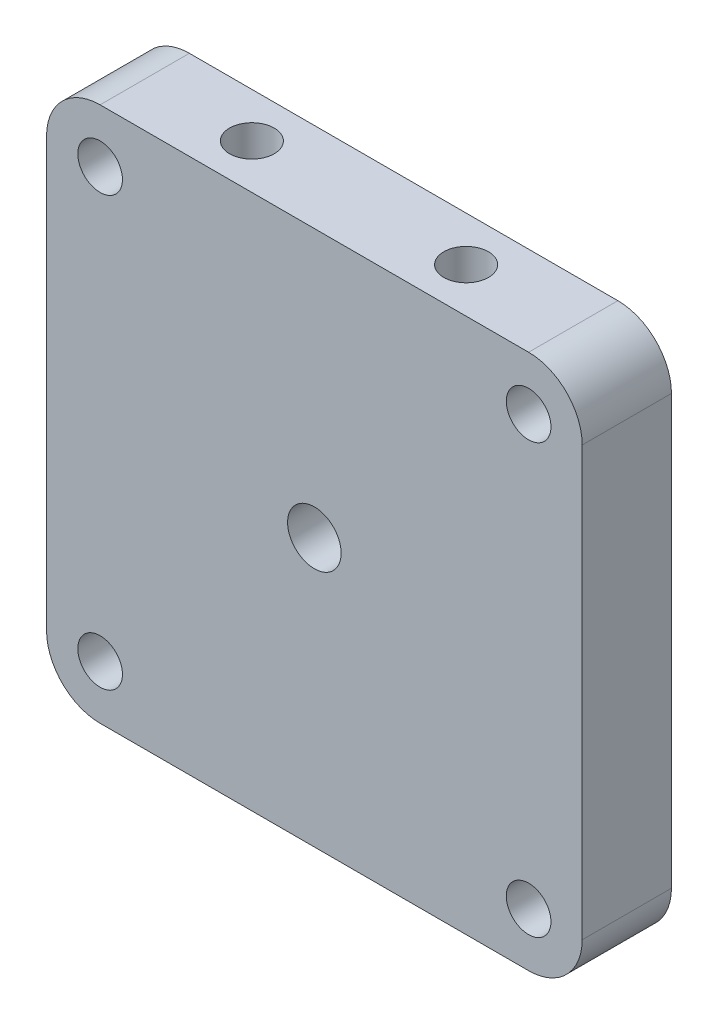
ISO-10303-21;
HEADER;
FILE_DESCRIPTION(('STEP AP214'),'2;1');
FILE_NAME('part.step','',(''),(''),'','','');
FILE_SCHEMA(('AUTOMOTIVE_DESIGN { 1 0 10303 214 1 1 1 1 }'));
ENDSEC;
DATA;
#1=APPLICATION_CONTEXT('core data for automotive mechanical design processes');
#2=APPLICATION_PROTOCOL_DEFINITION('international standard','automotive_design',2000,#1);
#3=PRODUCT_CONTEXT('',#1,'mechanical');
#4=PRODUCT('Part','Part','',(#3));
#5=PRODUCT_RELATED_PRODUCT_CATEGORY('part','',(#4));
#6=PRODUCT_DEFINITION_FORMATION('','',#4);
#7=PRODUCT_DEFINITION_CONTEXT('part definition',#1,'design');
#8=PRODUCT_DEFINITION('design','',#6,#7);
#9=PRODUCT_DEFINITION_SHAPE('','',#8);
#10=(LENGTH_UNIT() NAMED_UNIT(*) SI_UNIT(.MILLI.,.METRE.));
#11=(NAMED_UNIT(*) PLANE_ANGLE_UNIT() SI_UNIT($,.RADIAN.));
#12=(NAMED_UNIT(*) SI_UNIT($,.STERADIAN.) SOLID_ANGLE_UNIT());
#13=UNCERTAINTY_MEASURE_WITH_UNIT(LENGTH_MEASURE(1.E-05),#10,'distance_accuracy_value','');
#14=(GEOMETRIC_REPRESENTATION_CONTEXT(3) GLOBAL_UNCERTAINTY_ASSIGNED_CONTEXT((#13)) GLOBAL_UNIT_ASSIGNED_CONTEXT((#10,
#11,#12)) REPRESENTATION_CONTEXT('',''));
#15=CARTESIAN_POINT('',(0.,0.,0.));
#16=DIRECTION('',(0.,0.,1.));
#17=DIRECTION('',(1.,0.,0.));
#18=AXIS2_PLACEMENT_3D('',#15,#16,#17);
#19=CARTESIAN_POINT('',(0.,0.,5.));
#20=DIRECTION('',(0.,0.,-1.));
#21=DIRECTION('',(-1.,0.,0.));
#22=AXIS2_PLACEMENT_3D('',#19,#20,#21);
#23=PLANE('',#22);
#24=CARTESIAN_POINT('',(15.,15.,5.));
#25=DIRECTION('',(0.,0.,-1.));
#26=DIRECTION('',(-1.,0.,0.));
#27=AXIS2_PLACEMENT_3D('',#24,#25,#26);
#28=CIRCLE('',#27,1.5);
#29=CARTESIAN_POINT('',(13.5,15.,5.));
#30=VERTEX_POINT('',#29);
#31=EDGE_CURVE('E191',#30,#30,#28,.T.);
#32=ORIENTED_EDGE('',*,*,#31,.T.);
#33=EDGE_LOOP('',(#32));
#34=FACE_BOUND('',#33,.T.);
#35=DIRECTION('',(1.,0.,0.));
#36=VECTOR('',#35,1.);
#37=CARTESIAN_POINT('',(0.,0.,5.));
#38=LINE('',#37,#36);
#39=CARTESIAN_POINT('',(3.,0.,5.));
#40=VERTEX_POINT('',#39);
#41=CARTESIAN_POINT('',(27.,0.,5.));
#42=VERTEX_POINT('',#41);
#43=EDGE_CURVE('E149',#40,#42,#38,.T.);
#44=ORIENTED_EDGE('',*,*,#43,.T.);
#45=CARTESIAN_POINT('',(27.,3.,5.));
#46=DIRECTION('',(0.,0.,-1.));
#47=DIRECTION('',(-1.,0.,0.));
#48=AXIS2_PLACEMENT_3D('',#45,#46,#47);
#49=CIRCLE('',#48,3.);
#50=CARTESIAN_POINT('',(30.,3.,5.));
#51=VERTEX_POINT('',#50);
#52=EDGE_CURVE('E25',#42,#51,#49,.F.);
#53=ORIENTED_EDGE('',*,*,#52,.T.);
#54=DIRECTION('',(0.,1.,0.));
#55=VECTOR('',#54,1.);
#56=CARTESIAN_POINT('',(30.,30.,5.));
#57=LINE('',#56,#55);
#58=CARTESIAN_POINT('',(30.,27.,5.));
#59=VERTEX_POINT('',#58);
#60=EDGE_CURVE('E148',#51,#59,#57,.T.);
#61=ORIENTED_EDGE('',*,*,#60,.T.);
#62=CARTESIAN_POINT('',(27.,27.,5.));
#63=DIRECTION('',(0.,0.,-1.));
#64=DIRECTION('',(-1.,0.,0.));
#65=AXIS2_PLACEMENT_3D('',#62,#63,#64);
#66=CIRCLE('',#65,3.);
#67=CARTESIAN_POINT('',(27.,30.,5.));
#68=VERTEX_POINT('',#67);
#69=EDGE_CURVE('E32',#59,#68,#66,.F.);
#70=ORIENTED_EDGE('',*,*,#69,.T.);
#71=DIRECTION('',(-1.,0.,0.));
#72=VECTOR('',#71,1.);
#73=CARTESIAN_POINT('',(0.,30.,5.));
#74=LINE('',#73,#72);
#75=CARTESIAN_POINT('',(3.,30.,5.));
#76=VERTEX_POINT('',#75);
#77=EDGE_CURVE('E97',#68,#76,#74,.T.);
#78=ORIENTED_EDGE('',*,*,#77,.T.);
#79=CARTESIAN_POINT('',(3.,27.,5.));
#80=DIRECTION('',(0.,0.,-1.));
#81=DIRECTION('',(-1.,0.,0.));
#82=AXIS2_PLACEMENT_3D('',#79,#80,#81);
#83=CIRCLE('',#82,3.);
#84=CARTESIAN_POINT('',(0.,27.,5.));
#85=VERTEX_POINT('',#84);
#86=EDGE_CURVE('E130',#76,#85,#83,.F.);
#87=ORIENTED_EDGE('',*,*,#86,.T.);
#88=DIRECTION('',(0.,-1.,0.));
#89=VECTOR('',#88,1.);
#90=CARTESIAN_POINT('',(0.,0.,5.));
#91=LINE('',#90,#89);
#92=CARTESIAN_POINT('',(0.,3.,5.));
#93=VERTEX_POINT('',#92);
#94=EDGE_CURVE('E106',#85,#93,#91,.T.);
#95=ORIENTED_EDGE('',*,*,#94,.T.);
#96=CARTESIAN_POINT('',(3.,3.,5.));
#97=DIRECTION('',(0.,0.,-1.));
#98=DIRECTION('',(-1.,0.,0.));
#99=AXIS2_PLACEMENT_3D('',#96,#97,#98);
#100=CIRCLE('',#99,3.);
#101=EDGE_CURVE('E108',#93,#40,#100,.F.);
#102=ORIENTED_EDGE('',*,*,#101,.T.);
#103=EDGE_LOOP('',(#44,#53,#61,#70,#78,#87,#95,#102));
#104=FACE_BOUND('',#103,.T.);
#105=CARTESIAN_POINT('',(3.,27.,5.));
#106=DIRECTION('',(0.,0.,1.));
#107=DIRECTION('',(1.,0.,0.));
#108=AXIS2_PLACEMENT_3D('',#105,#106,#107);
#109=CIRCLE('',#108,1.25);
#110=CARTESIAN_POINT('',(4.25,27.,5.));
#111=VERTEX_POINT('',#110);
#112=EDGE_CURVE('E115',#111,#111,#109,.T.);
#113=ORIENTED_EDGE('',*,*,#112,.F.);
#114=EDGE_LOOP('',(#113));
#115=FACE_BOUND('',#114,.T.);
#116=CARTESIAN_POINT('',(3.,3.,5.));
#117=DIRECTION('',(0.,0.,1.));
#118=DIRECTION('',(1.,0.,0.));
#119=AXIS2_PLACEMENT_3D('',#116,#117,#118);
#120=CIRCLE('',#119,1.25);
#121=CARTESIAN_POINT('',(4.25,3.,5.));
#122=VERTEX_POINT('',#121);
#123=EDGE_CURVE('E168',#122,#122,#120,.T.);
#124=ORIENTED_EDGE('',*,*,#123,.F.);
#125=EDGE_LOOP('',(#124));
#126=FACE_BOUND('',#125,.T.);
#127=CARTESIAN_POINT('',(27.,27.,5.));
#128=DIRECTION('',(0.,0.,1.));
#129=DIRECTION('',(1.,0.,0.));
#130=AXIS2_PLACEMENT_3D('',#127,#128,#129);
#131=CIRCLE('',#130,1.25);
#132=CARTESIAN_POINT('',(28.25,27.,5.));
#133=VERTEX_POINT('',#132);
#134=EDGE_CURVE('E173',#133,#133,#131,.T.);
#135=ORIENTED_EDGE('',*,*,#134,.F.);
#136=EDGE_LOOP('',(#135));
#137=FACE_BOUND('',#136,.T.);
#138=CARTESIAN_POINT('',(27.,3.,5.));
#139=DIRECTION('',(0.,0.,1.));
#140=DIRECTION('',(1.,0.,0.));
#141=AXIS2_PLACEMENT_3D('',#138,#139,#140);
#142=CIRCLE('',#141,1.25);
#143=CARTESIAN_POINT('',(28.25,3.,5.));
#144=VERTEX_POINT('',#143);
#145=EDGE_CURVE('E179',#144,#144,#142,.T.);
#146=ORIENTED_EDGE('',*,*,#145,.F.);
#147=EDGE_LOOP('',(#146));
#148=FACE_BOUND('',#147,.T.);
#149=ADVANCED_FACE('F17',(#34,#104,#115,#126,#137,#148),#23,.F.);
#150=CARTESIAN_POINT('',(0.,0.,0.));
#151=DIRECTION('',(0.,0.,-1.));
#152=DIRECTION('',(-1.,0.,0.));
#153=AXIS2_PLACEMENT_3D('',#150,#151,#152);
#154=PLANE('',#153);
#155=DIRECTION('',(0.,1.,0.));
#156=VECTOR('',#155,1.);
#157=CARTESIAN_POINT('',(30.,30.,0.));
#158=LINE('',#157,#156);
#159=CARTESIAN_POINT('',(30.,3.,0.));
#160=VERTEX_POINT('',#159);
#161=CARTESIAN_POINT('',(30.,27.,0.));
#162=VERTEX_POINT('',#161);
#163=EDGE_CURVE('E157',#160,#162,#158,.T.);
#164=ORIENTED_EDGE('',*,*,#163,.F.);
#165=CARTESIAN_POINT('',(27.,3.,0.));
#166=DIRECTION('',(0.,0.,-1.));
#167=DIRECTION('',(-1.,0.,0.));
#168=AXIS2_PLACEMENT_3D('',#165,#166,#167);
#169=CIRCLE('',#168,3.);
#170=CARTESIAN_POINT('',(27.,0.,0.));
#171=VERTEX_POINT('',#170);
#172=EDGE_CURVE('E142',#160,#171,#169,.T.);
#173=ORIENTED_EDGE('',*,*,#172,.T.);
#174=DIRECTION('',(1.,0.,0.));
#175=VECTOR('',#174,1.);
#176=CARTESIAN_POINT('',(0.,0.,0.));
#177=LINE('',#176,#175);
#178=CARTESIAN_POINT('',(3.,0.,0.));
#179=VERTEX_POINT('',#178);
#180=EDGE_CURVE('E114',#179,#171,#177,.T.);
#181=ORIENTED_EDGE('',*,*,#180,.F.);
#182=CARTESIAN_POINT('',(3.,3.,0.));
#183=DIRECTION('',(0.,0.,-1.));
#184=DIRECTION('',(-1.,0.,0.));
#185=AXIS2_PLACEMENT_3D('',#182,#183,#184);
#186=CIRCLE('',#185,3.);
#187=CARTESIAN_POINT('',(0.,3.,0.));
#188=VERTEX_POINT('',#187);
#189=EDGE_CURVE('E96',#179,#188,#186,.T.);
#190=ORIENTED_EDGE('',*,*,#189,.T.);
#191=DIRECTION('',(0.,-1.,0.));
#192=VECTOR('',#191,1.);
#193=CARTESIAN_POINT('',(0.,0.,0.));
#194=LINE('',#193,#192);
#195=CARTESIAN_POINT('',(0.,27.,0.));
#196=VERTEX_POINT('',#195);
#197=EDGE_CURVE('E103',#196,#188,#194,.T.);
#198=ORIENTED_EDGE('',*,*,#197,.F.);
#199=CARTESIAN_POINT('',(3.,27.,0.));
#200=DIRECTION('',(0.,0.,-1.));
#201=DIRECTION('',(-1.,0.,0.));
#202=AXIS2_PLACEMENT_3D('',#199,#200,#201);
#203=CIRCLE('',#202,3.);
#204=CARTESIAN_POINT('',(3.,30.,0.));
#205=VERTEX_POINT('',#204);
#206=EDGE_CURVE('E86',#196,#205,#203,.T.);
#207=ORIENTED_EDGE('',*,*,#206,.T.);
#208=DIRECTION('',(-1.,0.,0.));
#209=VECTOR('',#208,1.);
#210=CARTESIAN_POINT('',(0.,30.,0.));
#211=LINE('',#210,#209);
#212=CARTESIAN_POINT('',(27.,30.,0.));
#213=VERTEX_POINT('',#212);
#214=EDGE_CURVE('E117',#213,#205,#211,.T.);
#215=ORIENTED_EDGE('',*,*,#214,.F.);
#216=CARTESIAN_POINT('',(27.,27.,0.));
#217=DIRECTION('',(0.,0.,-1.));
#218=DIRECTION('',(-1.,0.,0.));
#219=AXIS2_PLACEMENT_3D('',#216,#217,#218);
#220=CIRCLE('',#219,3.);
#221=EDGE_CURVE('E140',#213,#162,#220,.T.);
#222=ORIENTED_EDGE('',*,*,#221,.T.);
#223=EDGE_LOOP('',(#164,#173,#181,#190,#198,#207,#215,#222));
#224=FACE_BOUND('',#223,.T.);
#225=CARTESIAN_POINT('',(15.,15.,0.));
#226=DIRECTION('',(0.,0.,-1.));
#227=DIRECTION('',(-1.,0.,0.));
#228=AXIS2_PLACEMENT_3D('',#225,#226,#227);
#229=CIRCLE('',#228,3.);
#230=CARTESIAN_POINT('',(12.,15.,0.));
#231=VERTEX_POINT('',#230);
#232=EDGE_CURVE('E188',#231,#231,#229,.T.);
#233=ORIENTED_EDGE('',*,*,#232,.F.);
#234=EDGE_LOOP('',(#233));
#235=FACE_BOUND('',#234,.T.);
#236=CARTESIAN_POINT('',(27.,27.,0.));
#237=DIRECTION('',(0.,0.,1.));
#238=DIRECTION('',(1.,0.,0.));
#239=AXIS2_PLACEMENT_3D('',#236,#237,#238);
#240=CIRCLE('',#239,1.25);
#241=CARTESIAN_POINT('',(28.25,27.,0.));
#242=VERTEX_POINT('',#241);
#243=EDGE_CURVE('E176',#242,#242,#240,.T.);
#244=ORIENTED_EDGE('',*,*,#243,.T.);
#245=EDGE_LOOP('',(#244));
#246=FACE_BOUND('',#245,.T.);
#247=CARTESIAN_POINT('',(3.,27.,0.));
#248=DIRECTION('',(0.,0.,1.));
#249=DIRECTION('',(1.,0.,0.));
#250=AXIS2_PLACEMENT_3D('',#247,#248,#249);
#251=CIRCLE('',#250,1.25);
#252=CARTESIAN_POINT('',(4.25,27.,0.));
#253=VERTEX_POINT('',#252);
#254=EDGE_CURVE('E120',#253,#253,#251,.T.);
#255=ORIENTED_EDGE('',*,*,#254,.T.);
#256=EDGE_LOOP('',(#255));
#257=FACE_BOUND('',#256,.T.);
#258=CARTESIAN_POINT('',(3.,3.,0.));
#259=DIRECTION('',(0.,0.,1.));
#260=DIRECTION('',(1.,0.,0.));
#261=AXIS2_PLACEMENT_3D('',#258,#259,#260);
#262=CIRCLE('',#261,1.25);
#263=CARTESIAN_POINT('',(4.25,3.,0.));
#264=VERTEX_POINT('',#263);
#265=EDGE_CURVE('E170',#264,#264,#262,.T.);
#266=ORIENTED_EDGE('',*,*,#265,.T.);
#267=EDGE_LOOP('',(#266));
#268=FACE_BOUND('',#267,.T.);
#269=CARTESIAN_POINT('',(27.,3.,0.));
#270=DIRECTION('',(0.,0.,1.));
#271=DIRECTION('',(1.,0.,0.));
#272=AXIS2_PLACEMENT_3D('',#269,#270,#271);
#273=CIRCLE('',#272,1.25);
#274=CARTESIAN_POINT('',(28.25,3.,0.));
#275=VERTEX_POINT('',#274);
#276=EDGE_CURVE('E182',#275,#275,#273,.T.);
#277=ORIENTED_EDGE('',*,*,#276,.T.);
#278=EDGE_LOOP('',(#277));
#279=FACE_BOUND('',#278,.T.);
#280=ADVANCED_FACE('F111',(#224,#235,#246,#257,#268,#279),#154,.T.);
#281=CARTESIAN_POINT('',(0.,0.,5.));
#282=DIRECTION('',(1.,0.,0.));
#283=DIRECTION('',(0.,0.,-1.));
#284=AXIS2_PLACEMENT_3D('',#281,#282,#283);
#285=PLANE('',#284);
#286=ORIENTED_EDGE('',*,*,#197,.T.);
#287=DIRECTION('',(0.,0.,-1.));
#288=VECTOR('',#287,1.);
#289=CARTESIAN_POINT('',(0.,3.,5.));
#290=LINE('',#289,#288);
#291=EDGE_CURVE('E107',#188,#93,#290,.F.);
#292=ORIENTED_EDGE('',*,*,#291,.T.);
#293=ORIENTED_EDGE('',*,*,#94,.F.);
#294=DIRECTION('',(0.,0.,-1.));
#295=VECTOR('',#294,1.);
#296=CARTESIAN_POINT('',(0.,27.,5.));
#297=LINE('',#296,#295);
#298=EDGE_CURVE('E90',#85,#196,#297,.T.);
#299=ORIENTED_EDGE('',*,*,#298,.T.);
#300=EDGE_LOOP('',(#286,#292,#293,#299));
#301=FACE_BOUND('',#300,.T.);
#302=ADVANCED_FACE('F102',(#301),#285,.F.);
#303=CARTESIAN_POINT('',(0.,0.,5.));
#304=DIRECTION('',(0.,1.,0.));
#305=DIRECTION('',(0.,0.,1.));
#306=AXIS2_PLACEMENT_3D('',#303,#304,#305);
#307=PLANE('',#306);
#308=CARTESIAN_POINT('',(21.,0.,2.5));
#309=DIRECTION('',(0.,-1.,0.));
#310=DIRECTION('',(0.,0.,-1.));
#311=AXIS2_PLACEMENT_3D('',#308,#309,#310);
#312=CIRCLE('',#311,1.25);
#313=CARTESIAN_POINT('',(21.,0.,1.25));
#314=VERTEX_POINT('',#313);
#315=EDGE_CURVE('E206',#314,#314,#312,.T.);
#316=ORIENTED_EDGE('',*,*,#315,.F.);
#317=EDGE_LOOP('',(#316));
#318=FACE_BOUND('',#317,.T.);
#319=CARTESIAN_POINT('',(9.,0.,2.5));
#320=DIRECTION('',(0.,-1.,0.));
#321=DIRECTION('',(0.,0.,-1.));
#322=AXIS2_PLACEMENT_3D('',#319,#320,#321);
#323=CIRCLE('',#322,1.25);
#324=CARTESIAN_POINT('',(9.,0.,1.25));
#325=VERTEX_POINT('',#324);
#326=EDGE_CURVE('E200',#325,#325,#323,.T.);
#327=ORIENTED_EDGE('',*,*,#326,.F.);
#328=EDGE_LOOP('',(#327));
#329=FACE_BOUND('',#328,.T.);
#330=ORIENTED_EDGE('',*,*,#180,.T.);
#331=DIRECTION('',(0.,0.,-1.));
#332=VECTOR('',#331,1.);
#333=CARTESIAN_POINT('',(27.,0.,5.));
#334=LINE('',#333,#332);
#335=EDGE_CURVE('E40',#171,#42,#334,.F.);
#336=ORIENTED_EDGE('',*,*,#335,.T.);
#337=ORIENTED_EDGE('',*,*,#43,.F.);
#338=DIRECTION('',(0.,0.,-1.));
#339=VECTOR('',#338,1.);
#340=CARTESIAN_POINT('',(3.,0.,5.));
#341=LINE('',#340,#339);
#342=EDGE_CURVE('E127',#40,#179,#341,.T.);
#343=ORIENTED_EDGE('',*,*,#342,.T.);
#344=EDGE_LOOP('',(#330,#336,#337,#343));
#345=FACE_BOUND('',#344,.T.);
#346=ADVANCED_FACE('F160',(#318,#329,#345),#307,.F.);
#347=CARTESIAN_POINT('',(0.,30.,5.));
#348=DIRECTION('',(0.,-1.,0.));
#349=DIRECTION('',(0.,0.,-1.));
#350=AXIS2_PLACEMENT_3D('',#347,#348,#349);
#351=PLANE('',#350);
#352=CARTESIAN_POINT('',(21.,30.,2.5));
#353=DIRECTION('',(0.,-1.,0.));
#354=DIRECTION('',(0.,0.,-1.));
#355=AXIS2_PLACEMENT_3D('',#352,#353,#354);
#356=CIRCLE('',#355,1.25);
#357=CARTESIAN_POINT('',(21.,30.,1.25));
#358=VERTEX_POINT('',#357);
#359=EDGE_CURVE('E198',#358,#358,#356,.T.);
#360=ORIENTED_EDGE('',*,*,#359,.T.);
#361=EDGE_LOOP('',(#360));
#362=FACE_BOUND('',#361,.T.);
#363=CARTESIAN_POINT('',(9.,30.,2.5));
#364=DIRECTION('',(0.,-1.,0.));
#365=DIRECTION('',(0.,0.,-1.));
#366=AXIS2_PLACEMENT_3D('',#363,#364,#365);
#367=CIRCLE('',#366,1.25);
#368=CARTESIAN_POINT('',(9.,30.,1.25));
#369=VERTEX_POINT('',#368);
#370=EDGE_CURVE('E203',#369,#369,#367,.T.);
#371=ORIENTED_EDGE('',*,*,#370,.T.);
#372=EDGE_LOOP('',(#371));
#373=FACE_BOUND('',#372,.T.);
#374=ORIENTED_EDGE('',*,*,#77,.F.);
#375=DIRECTION('',(0.,0.,-1.));
#376=VECTOR('',#375,1.);
#377=CARTESIAN_POINT('',(27.,30.,5.));
#378=LINE('',#377,#376);
#379=EDGE_CURVE('E11',#68,#213,#378,.T.);
#380=ORIENTED_EDGE('',*,*,#379,.T.);
#381=ORIENTED_EDGE('',*,*,#214,.T.);
#382=DIRECTION('',(0.,0.,-1.));
#383=VECTOR('',#382,1.);
#384=CARTESIAN_POINT('',(3.,30.,5.));
#385=LINE('',#384,#383);
#386=EDGE_CURVE('E92',#205,#76,#385,.F.);
#387=ORIENTED_EDGE('',*,*,#386,.T.);
#388=EDGE_LOOP('',(#374,#380,#381,#387));
#389=FACE_BOUND('',#388,.T.);
#390=ADVANCED_FACE('F212',(#362,#373,#389),#351,.F.);
#391=CARTESIAN_POINT('',(3.,27.,5.));
#392=DIRECTION('',(0.,0.,-1.));
#393=DIRECTION('',(-1.,0.,0.));
#394=AXIS2_PLACEMENT_3D('',#391,#392,#393);
#395=CYLINDRICAL_SURFACE('',#394,1.25);
#396=ORIENTED_EDGE('',*,*,#112,.T.);
#397=EDGE_LOOP('',(#396));
#398=FACE_BOUND('',#397,.T.);
#399=ORIENTED_EDGE('',*,*,#254,.F.);
#400=EDGE_LOOP('',(#399));
#401=FACE_BOUND('',#400,.T.);
#402=ADVANCED_FACE('F247',(#398,#401),#395,.F.);
#403=CARTESIAN_POINT('',(3.,3.,5.));
#404=DIRECTION('',(0.,0.,-1.));
#405=DIRECTION('',(-1.,0.,0.));
#406=AXIS2_PLACEMENT_3D('',#403,#404,#405);
#407=CYLINDRICAL_SURFACE('',#406,1.25);
#408=ORIENTED_EDGE('',*,*,#123,.T.);
#409=EDGE_LOOP('',(#408));
#410=FACE_BOUND('',#409,.T.);
#411=ORIENTED_EDGE('',*,*,#265,.F.);
#412=EDGE_LOOP('',(#411));
#413=FACE_BOUND('',#412,.T.);
#414=ADVANCED_FACE('F284',(#410,#413),#407,.F.);
#415=CARTESIAN_POINT('',(27.,27.,5.));
#416=DIRECTION('',(0.,0.,-1.));
#417=DIRECTION('',(-1.,0.,0.));
#418=AXIS2_PLACEMENT_3D('',#415,#416,#417);
#419=CYLINDRICAL_SURFACE('',#418,1.25);
#420=ORIENTED_EDGE('',*,*,#134,.T.);
#421=EDGE_LOOP('',(#420));
#422=FACE_BOUND('',#421,.T.);
#423=ORIENTED_EDGE('',*,*,#243,.F.);
#424=EDGE_LOOP('',(#423));
#425=FACE_BOUND('',#424,.T.);
#426=ADVANCED_FACE('F281',(#422,#425),#419,.F.);
#427=CARTESIAN_POINT('',(27.,3.,5.));
#428=DIRECTION('',(0.,0.,-1.));
#429=DIRECTION('',(-1.,0.,0.));
#430=AXIS2_PLACEMENT_3D('',#427,#428,#429);
#431=CYLINDRICAL_SURFACE('',#430,1.25);
#432=ORIENTED_EDGE('',*,*,#145,.T.);
#433=EDGE_LOOP('',(#432));
#434=FACE_BOUND('',#433,.T.);
#435=ORIENTED_EDGE('',*,*,#276,.F.);
#436=EDGE_LOOP('',(#435));
#437=FACE_BOUND('',#436,.T.);
#438=ADVANCED_FACE('F256',(#434,#437),#431,.F.);
#439=CARTESIAN_POINT('',(3.,3.,5.));
#440=DIRECTION('',(0.,0.,-1.));
#441=DIRECTION('',(-1.,0.,0.));
#442=AXIS2_PLACEMENT_3D('',#439,#440,#441);
#443=CYLINDRICAL_SURFACE('',#442,3.);
#444=ORIENTED_EDGE('',*,*,#101,.F.);
#445=ORIENTED_EDGE('',*,*,#291,.F.);
#446=ORIENTED_EDGE('',*,*,#189,.F.);
#447=ORIENTED_EDGE('',*,*,#342,.F.);
#448=EDGE_LOOP('',(#444,#445,#446,#447));
#449=FACE_BOUND('',#448,.T.);
#450=ADVANCED_FACE('F164',(#449),#443,.T.);
#451=CARTESIAN_POINT('',(3.,27.,5.));
#452=DIRECTION('',(0.,0.,-1.));
#453=DIRECTION('',(-1.,0.,0.));
#454=AXIS2_PLACEMENT_3D('',#451,#452,#453);
#455=CYLINDRICAL_SURFACE('',#454,3.);
#456=ORIENTED_EDGE('',*,*,#86,.F.);
#457=ORIENTED_EDGE('',*,*,#386,.F.);
#458=ORIENTED_EDGE('',*,*,#206,.F.);
#459=ORIENTED_EDGE('',*,*,#298,.F.);
#460=EDGE_LOOP('',(#456,#457,#458,#459));
#461=FACE_BOUND('',#460,.T.);
#462=ADVANCED_FACE('F89',(#461),#455,.T.);
#463=CARTESIAN_POINT('',(15.,15.,1.));
#464=DIRECTION('',(0.,0.,-1.));
#465=DIRECTION('',(-1.,0.,0.));
#466=AXIS2_PLACEMENT_3D('',#463,#464,#465);
#467=CYLINDRICAL_SURFACE('',#466,3.);
#468=CARTESIAN_POINT('',(15.,15.,1.));
#469=DIRECTION('',(0.,0.,-1.));
#470=DIRECTION('',(-1.,0.,0.));
#471=AXIS2_PLACEMENT_3D('',#468,#469,#470);
#472=CIRCLE('',#471,3.);
#473=CARTESIAN_POINT('',(12.,15.,1.));
#474=VERTEX_POINT('',#473);
#475=EDGE_CURVE('E185',#474,#474,#472,.T.);
#476=ORIENTED_EDGE('',*,*,#475,.F.);
#477=EDGE_LOOP('',(#476));
#478=FACE_BOUND('',#477,.T.);
#479=ORIENTED_EDGE('',*,*,#232,.T.);
#480=EDGE_LOOP('',(#479));
#481=FACE_BOUND('',#480,.T.);
#482=ADVANCED_FACE('F258',(#478,#481),#467,.F.);
#483=CARTESIAN_POINT('',(15.,15.,1.));
#484=DIRECTION('',(0.,0.,-1.));
#485=DIRECTION('',(-1.,0.,0.));
#486=AXIS2_PLACEMENT_3D('',#483,#484,#485);
#487=PLANE('',#486);
#488=CARTESIAN_POINT('',(15.,15.,1.));
#489=DIRECTION('',(0.,0.,-1.));
#490=DIRECTION('',(-1.,0.,0.));
#491=AXIS2_PLACEMENT_3D('',#488,#489,#490);
#492=CIRCLE('',#491,1.5);
#493=CARTESIAN_POINT('',(13.5,15.,1.));
#494=VERTEX_POINT('',#493);
#495=EDGE_CURVE('E156',#494,#494,#492,.T.);
#496=ORIENTED_EDGE('',*,*,#495,.F.);
#497=EDGE_LOOP('',(#496));
#498=FACE_BOUND('',#497,.T.);
#499=ORIENTED_EDGE('',*,*,#475,.T.);
#500=EDGE_LOOP('',(#499));
#501=FACE_BOUND('',#500,.T.);
#502=ADVANCED_FACE('F269',(#498,#501),#487,.T.);
#503=CARTESIAN_POINT('',(15.,15.,5.));
#504=DIRECTION('',(0.,0.,-1.));
#505=DIRECTION('',(-1.,0.,0.));
#506=AXIS2_PLACEMENT_3D('',#503,#504,#505);
#507=CYLINDRICAL_SURFACE('',#506,1.5);
#508=ORIENTED_EDGE('',*,*,#31,.F.);
#509=EDGE_LOOP('',(#508));
#510=FACE_BOUND('',#509,.T.);
#511=ORIENTED_EDGE('',*,*,#495,.T.);
#512=EDGE_LOOP('',(#511));
#513=FACE_BOUND('',#512,.T.);
#514=ADVANCED_FACE('F264',(#510,#513),#507,.F.);
#515=CARTESIAN_POINT('',(30.,30.,5.));
#516=DIRECTION('',(-1.,0.,0.));
#517=DIRECTION('',(0.,-1.,0.));
#518=AXIS2_PLACEMENT_3D('',#515,#516,#517);
#519=PLANE('',#518);
#520=ORIENTED_EDGE('',*,*,#60,.F.);
#521=DIRECTION('',(0.,0.,-1.));
#522=VECTOR('',#521,1.);
#523=CARTESIAN_POINT('',(30.,3.,5.));
#524=LINE('',#523,#522);
#525=EDGE_CURVE('E137',#51,#160,#524,.T.);
#526=ORIENTED_EDGE('',*,*,#525,.T.);
#527=ORIENTED_EDGE('',*,*,#163,.T.);
#528=DIRECTION('',(0.,0.,-1.));
#529=VECTOR('',#528,1.);
#530=CARTESIAN_POINT('',(30.,27.,5.));
#531=LINE('',#530,#529);
#532=EDGE_CURVE('E135',#162,#59,#531,.F.);
#533=ORIENTED_EDGE('',*,*,#532,.T.);
#534=EDGE_LOOP('',(#520,#526,#527,#533));
#535=FACE_BOUND('',#534,.T.);
#536=ADVANCED_FACE('F153',(#535),#519,.F.);
#537=CARTESIAN_POINT('',(27.,3.,5.));
#538=DIRECTION('',(0.,0.,-1.));
#539=DIRECTION('',(-1.,0.,0.));
#540=AXIS2_PLACEMENT_3D('',#537,#538,#539);
#541=CYLINDRICAL_SURFACE('',#540,3.);
#542=ORIENTED_EDGE('',*,*,#52,.F.);
#543=ORIENTED_EDGE('',*,*,#335,.F.);
#544=ORIENTED_EDGE('',*,*,#172,.F.);
#545=ORIENTED_EDGE('',*,*,#525,.F.);
#546=EDGE_LOOP('',(#542,#543,#544,#545));
#547=FACE_BOUND('',#546,.T.);
#548=ADVANCED_FACE('F159',(#547),#541,.T.);
#549=CARTESIAN_POINT('',(27.,27.,5.));
#550=DIRECTION('',(0.,0.,-1.));
#551=DIRECTION('',(-1.,0.,0.));
#552=AXIS2_PLACEMENT_3D('',#549,#550,#551);
#553=CYLINDRICAL_SURFACE('',#552,3.);
#554=ORIENTED_EDGE('',*,*,#69,.F.);
#555=ORIENTED_EDGE('',*,*,#532,.F.);
#556=ORIENTED_EDGE('',*,*,#221,.F.);
#557=ORIENTED_EDGE('',*,*,#379,.F.);
#558=EDGE_LOOP('',(#554,#555,#556,#557));
#559=FACE_BOUND('',#558,.T.);
#560=ADVANCED_FACE('F19',(#559),#553,.T.);
#561=CARTESIAN_POINT('',(9.,30.,2.5));
#562=DIRECTION('',(0.,-1.,0.));
#563=DIRECTION('',(0.,0.,-1.));
#564=AXIS2_PLACEMENT_3D('',#561,#562,#563);
#565=CYLINDRICAL_SURFACE('',#564,1.25);
#566=ORIENTED_EDGE('',*,*,#370,.F.);
#567=EDGE_LOOP('',(#566));
#568=FACE_BOUND('',#567,.T.);
#569=ORIENTED_EDGE('',*,*,#326,.T.);
#570=EDGE_LOOP('',(#569));
#571=FACE_BOUND('',#570,.T.);
#572=ADVANCED_FACE('F218',(#568,#571),#565,.F.);
#573=CARTESIAN_POINT('',(21.,30.,2.5));
#574=DIRECTION('',(0.,-1.,0.));
#575=DIRECTION('',(0.,0.,-1.));
#576=AXIS2_PLACEMENT_3D('',#573,#574,#575);
#577=CYLINDRICAL_SURFACE('',#576,1.25);
#578=ORIENTED_EDGE('',*,*,#359,.F.);
#579=EDGE_LOOP('',(#578));
#580=FACE_BOUND('',#579,.T.);
#581=ORIENTED_EDGE('',*,*,#315,.T.);
#582=EDGE_LOOP('',(#581));
#583=FACE_BOUND('',#582,.T.);
#584=ADVANCED_FACE('F215',(#580,#583),#577,.F.);
#585=CLOSED_SHELL('',(#149,#280,#302,#346,#390,#402,#414,#426,#438,#450,#462,#482,#502,#514,
#536,#548,#560,#572,#584));
#586=MANIFOLD_SOLID_BREP('B1',#585);
#587=ADVANCED_BREP_SHAPE_REPRESENTATION('',(#18,#586),#14);
#588=SHAPE_DEFINITION_REPRESENTATION(#9,#587);
ENDSEC;
END-ISO-10303-21;
